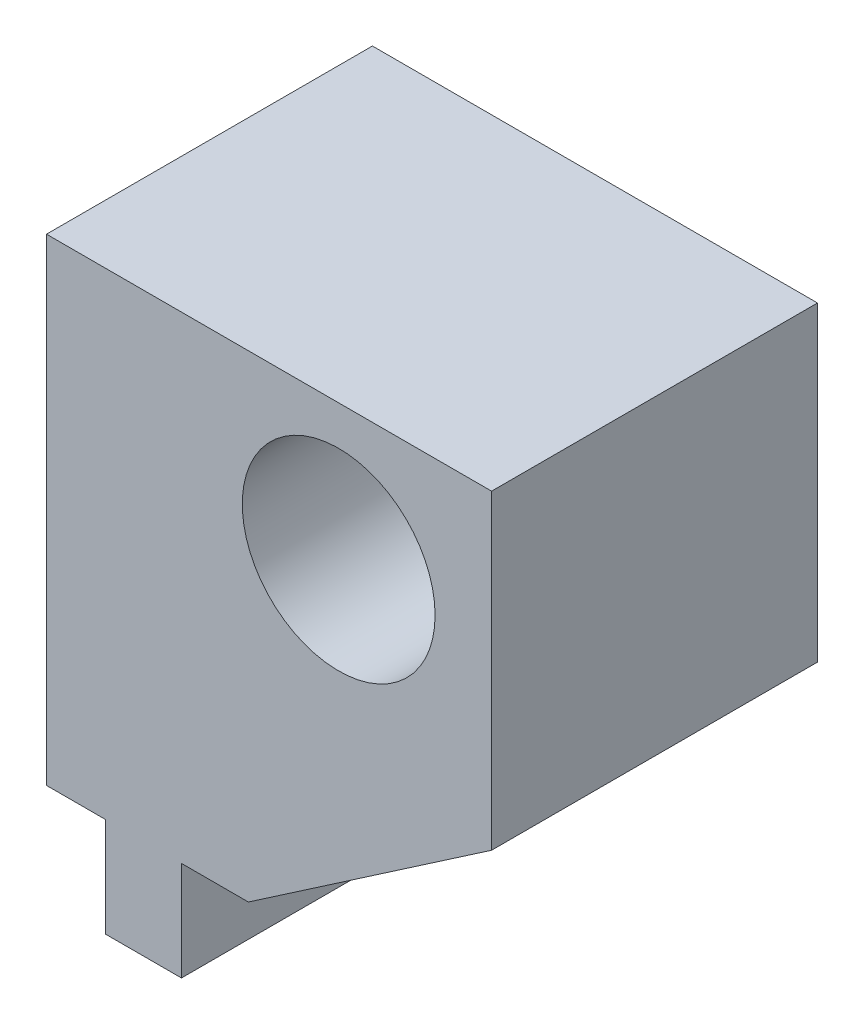
ISO-10303-21;
HEADER;
FILE_DESCRIPTION(('STEP AP214'),'2;1');
FILE_NAME('part.step','',(''),(''),'','','');
FILE_SCHEMA(('AUTOMOTIVE_DESIGN { 1 0 10303 214 1 1 1 1 }'));
ENDSEC;
DATA;
#1=APPLICATION_CONTEXT('core data for automotive mechanical design processes');
#2=APPLICATION_PROTOCOL_DEFINITION('international standard','automotive_design',2000,#1);
#3=PRODUCT_CONTEXT('',#1,'mechanical');
#4=PRODUCT('Part','Part','',(#3));
#5=PRODUCT_RELATED_PRODUCT_CATEGORY('part','',(#4));
#6=PRODUCT_DEFINITION_FORMATION('','',#4);
#7=PRODUCT_DEFINITION_CONTEXT('part definition',#1,'design');
#8=PRODUCT_DEFINITION('design','',#6,#7);
#9=PRODUCT_DEFINITION_SHAPE('','',#8);
#10=(LENGTH_UNIT() NAMED_UNIT(*) SI_UNIT(.MILLI.,.METRE.));
#11=(NAMED_UNIT(*) PLANE_ANGLE_UNIT() SI_UNIT($,.RADIAN.));
#12=(NAMED_UNIT(*) SI_UNIT($,.STERADIAN.) SOLID_ANGLE_UNIT());
#13=UNCERTAINTY_MEASURE_WITH_UNIT(LENGTH_MEASURE(1.E-05),#10,'distance_accuracy_value','');
#14=(GEOMETRIC_REPRESENTATION_CONTEXT(3) GLOBAL_UNCERTAINTY_ASSIGNED_CONTEXT((#13)) GLOBAL_UNIT_ASSIGNED_CONTEXT((#10,
#11,#12)) REPRESENTATION_CONTEXT('',''));
#15=CARTESIAN_POINT('',(0.,0.,0.));
#16=DIRECTION('',(0.,0.,1.));
#17=DIRECTION('',(1.,0.,0.));
#18=AXIS2_PLACEMENT_3D('',#15,#16,#17);
#19=CARTESIAN_POINT('',(0.,0.,36.));
#20=DIRECTION('',(0.,0.,-1.));
#21=DIRECTION('',(-1.,0.,0.));
#22=AXIS2_PLACEMENT_3D('',#19,#20,#21);
#23=PLANE('',#22);
#24=DIRECTION('',(-1.,0.,0.));
#25=VECTOR('',#24,1.);
#26=CARTESIAN_POINT('',(-32.2750876484006,15.,36.));
#27=LINE('',#26,#25);
#28=CARTESIAN_POINT('',(16.8902459314217,15.,36.));
#29=VERTEX_POINT('',#28);
#30=CARTESIAN_POINT('',(-32.2750876484006,15.,36.));
#31=VERTEX_POINT('',#30);
#32=EDGE_CURVE('E160',#29,#31,#27,.T.);
#33=ORIENTED_EDGE('',*,*,#32,.T.);
#34=DIRECTION('',(0.,-1.,0.));
#35=VECTOR('',#34,1.);
#36=CARTESIAN_POINT('',(-32.2750876484006,11.1748033875287,36.));
#37=LINE('',#36,#35);
#38=CARTESIAN_POINT('',(-32.2750876484006,-37.7378285823876,36.));
#39=VERTEX_POINT('',#38);
#40=EDGE_CURVE('E99',#31,#39,#37,.T.);
#41=ORIENTED_EDGE('',*,*,#40,.T.);
#42=DIRECTION('',(1.,0.,0.));
#43=VECTOR('',#42,1.);
#44=CARTESIAN_POINT('',(-25.7451896776057,-37.7378285823876,36.));
#45=LINE('',#44,#43);
#46=CARTESIAN_POINT('',(-25.7451896776057,-37.7378285823876,36.));
#47=VERTEX_POINT('',#46);
#48=EDGE_CURVE('E178',#39,#47,#45,.T.);
#49=ORIENTED_EDGE('',*,*,#48,.T.);
#50=DIRECTION('',(0.,-1.,0.));
#51=VECTOR('',#50,1.);
#52=CARTESIAN_POINT('',(-25.7451896776057,-48.7031289484394,36.));
#53=LINE('',#52,#51);
#54=CARTESIAN_POINT('',(-25.7451896776057,-48.7031289484394,36.));
#55=VERTEX_POINT('',#54);
#56=EDGE_CURVE('E193',#47,#55,#53,.T.);
#57=ORIENTED_EDGE('',*,*,#56,.T.);
#58=DIRECTION('',(1.,0.,0.));
#59=VECTOR('',#58,1.);
#60=CARTESIAN_POINT('',(-17.3672073754538,-48.7031289484394,36.));
#61=LINE('',#60,#59);
#62=CARTESIAN_POINT('',(-17.3672073754538,-48.7031289484394,36.));
#63=VERTEX_POINT('',#62);
#64=EDGE_CURVE('E192',#55,#63,#61,.T.);
#65=ORIENTED_EDGE('',*,*,#64,.T.);
#66=DIRECTION('',(0.,1.,0.));
#67=VECTOR('',#66,1.);
#68=CARTESIAN_POINT('',(-17.3672073754538,-37.7378285823876,36.));
#69=LINE('',#68,#67);
#70=CARTESIAN_POINT('',(-17.3672073754538,-37.7378285823876,36.));
#71=VERTEX_POINT('',#70);
#72=EDGE_CURVE('E122',#63,#71,#69,.T.);
#73=ORIENTED_EDGE('',*,*,#72,.T.);
#74=DIRECTION('',(1.,0.,0.));
#75=VECTOR('',#74,1.);
#76=CARTESIAN_POINT('',(-9.97487005002559,-37.7378285823876,36.));
#77=LINE('',#76,#75);
#78=CARTESIAN_POINT('',(-9.97487005002559,-37.7378285823876,36.));
#79=VERTEX_POINT('',#78);
#80=EDGE_CURVE('E115',#71,#79,#77,.T.);
#81=ORIENTED_EDGE('',*,*,#80,.T.);
#82=DIRECTION('',(0.825293596087087,0.564703887234402,0.));
#83=VECTOR('',#82,1.);
#84=CARTESIAN_POINT('',(16.8902459314217,-19.3554789583812,36.));
#85=LINE('',#84,#83);
#86=CARTESIAN_POINT('',(16.8902459314217,-19.3554789583812,36.));
#87=VERTEX_POINT('',#86);
#88=EDGE_CURVE('E119',#79,#87,#85,.T.);
#89=ORIENTED_EDGE('',*,*,#88,.T.);
#90=DIRECTION('',(0.,1.,0.));
#91=VECTOR('',#90,1.);
#92=CARTESIAN_POINT('',(16.8902459314217,4.29086534560921,36.));
#93=LINE('',#92,#91);
#94=EDGE_CURVE('E54',#87,#29,#93,.T.);
#95=ORIENTED_EDGE('',*,*,#94,.T.);
#96=EDGE_LOOP('',(#33,#41,#49,#57,#65,#73,#81,#89,#95));
#97=FACE_BOUND('',#96,.T.);
#98=CARTESIAN_POINT('',(0.,0.,36.));
#99=DIRECTION('',(0.,0.,1.));
#100=DIRECTION('',(1.,0.,0.));
#101=AXIS2_PLACEMENT_3D('',#98,#99,#100);
#102=CIRCLE('',#101,10.65);
#103=CARTESIAN_POINT('',(10.65,0.,36.));
#104=VERTEX_POINT('',#103);
#105=EDGE_CURVE('E145',#104,#104,#102,.T.);
#106=ORIENTED_EDGE('',*,*,#105,.F.);
#107=EDGE_LOOP('',(#106));
#108=FACE_BOUND('',#107,.T.);
#109=ADVANCED_FACE('F37',(#97,#108),#23,.F.);
#110=CARTESIAN_POINT('',(0.,0.,0.));
#111=DIRECTION('',(0.,0.,-1.));
#112=DIRECTION('',(-1.,0.,0.));
#113=AXIS2_PLACEMENT_3D('',#110,#111,#112);
#114=PLANE('',#113);
#115=DIRECTION('',(0.,-1.,0.));
#116=VECTOR('',#115,1.);
#117=CARTESIAN_POINT('',(-32.2750876484006,-37.7378285823876,0.));
#118=LINE('',#117,#116);
#119=CARTESIAN_POINT('',(-32.2750876484006,15.,0.));
#120=VERTEX_POINT('',#119);
#121=CARTESIAN_POINT('',(-32.2750876484006,-37.7378285823876,0.));
#122=VERTEX_POINT('',#121);
#123=EDGE_CURVE('E142',#120,#122,#118,.T.);
#124=ORIENTED_EDGE('',*,*,#123,.F.);
#125=DIRECTION('',(-1.,0.,0.));
#126=VECTOR('',#125,1.);
#127=CARTESIAN_POINT('',(-11.427868523813,15.,0.));
#128=LINE('',#127,#126);
#129=CARTESIAN_POINT('',(16.8902459314217,15.,0.));
#130=VERTEX_POINT('',#129);
#131=EDGE_CURVE('E157',#130,#120,#128,.T.);
#132=ORIENTED_EDGE('',*,*,#131,.F.);
#133=DIRECTION('',(0.,1.,0.));
#134=VECTOR('',#133,1.);
#135=CARTESIAN_POINT('',(16.8902459314217,15.,0.));
#136=LINE('',#135,#134);
#137=CARTESIAN_POINT('',(16.8902459314217,-19.3554789583812,0.));
#138=VERTEX_POINT('',#137);
#139=EDGE_CURVE('E86',#138,#130,#136,.T.);
#140=ORIENTED_EDGE('',*,*,#139,.F.);
#141=DIRECTION('',(0.825293596087087,0.564703887234402,0.));
#142=VECTOR('',#141,1.);
#143=CARTESIAN_POINT('',(16.8902459314217,-19.3554789583812,0.));
#144=LINE('',#143,#142);
#145=CARTESIAN_POINT('',(-9.97487005002559,-37.7378285823876,0.));
#146=VERTEX_POINT('',#145);
#147=EDGE_CURVE('E154',#146,#138,#144,.T.);
#148=ORIENTED_EDGE('',*,*,#147,.F.);
#149=DIRECTION('',(1.,0.,0.));
#150=VECTOR('',#149,1.);
#151=CARTESIAN_POINT('',(-9.97487005002559,-37.7378285823876,0.));
#152=LINE('',#151,#150);
#153=CARTESIAN_POINT('',(-17.3672073754538,-37.7378285823876,0.));
#154=VERTEX_POINT('',#153);
#155=EDGE_CURVE('E131',#154,#146,#152,.T.);
#156=ORIENTED_EDGE('',*,*,#155,.F.);
#157=DIRECTION('',(0.,1.,0.));
#158=VECTOR('',#157,1.);
#159=CARTESIAN_POINT('',(-17.3672073754538,-37.7378285823876,0.));
#160=LINE('',#159,#158);
#161=CARTESIAN_POINT('',(-17.3672073754538,-48.7031289484394,0.));
#162=VERTEX_POINT('',#161);
#163=EDGE_CURVE('E151',#162,#154,#160,.T.);
#164=ORIENTED_EDGE('',*,*,#163,.F.);
#165=DIRECTION('',(1.,0.,0.));
#166=VECTOR('',#165,1.);
#167=CARTESIAN_POINT('',(-17.3672073754538,-48.7031289484394,0.));
#168=LINE('',#167,#166);
#169=CARTESIAN_POINT('',(-25.7451896776057,-48.7031289484394,0.));
#170=VERTEX_POINT('',#169);
#171=EDGE_CURVE('E149',#170,#162,#168,.T.);
#172=ORIENTED_EDGE('',*,*,#171,.F.);
#173=DIRECTION('',(0.,-1.,0.));
#174=VECTOR('',#173,1.);
#175=CARTESIAN_POINT('',(-25.7451896776057,-48.7031289484394,0.));
#176=LINE('',#175,#174);
#177=CARTESIAN_POINT('',(-25.7451896776057,-37.7378285823876,0.));
#178=VERTEX_POINT('',#177);
#179=EDGE_CURVE('E147',#178,#170,#176,.T.);
#180=ORIENTED_EDGE('',*,*,#179,.F.);
#181=DIRECTION('',(1.,0.,0.));
#182=VECTOR('',#181,1.);
#183=CARTESIAN_POINT('',(-25.7451896776057,-37.7378285823876,0.));
#184=LINE('',#183,#182);
#185=EDGE_CURVE('E144',#122,#178,#184,.T.);
#186=ORIENTED_EDGE('',*,*,#185,.F.);
#187=EDGE_LOOP('',(#124,#132,#140,#148,#156,#164,#172,#180,#186));
#188=FACE_BOUND('',#187,.T.);
#189=CARTESIAN_POINT('',(0.,0.,0.));
#190=DIRECTION('',(0.,0.,1.));
#191=DIRECTION('',(1.,0.,0.));
#192=AXIS2_PLACEMENT_3D('',#189,#190,#191);
#193=CIRCLE('',#192,10.65);
#194=CARTESIAN_POINT('',(10.65,0.,0.));
#195=VERTEX_POINT('',#194);
#196=EDGE_CURVE('E200',#195,#195,#193,.T.);
#197=ORIENTED_EDGE('',*,*,#196,.T.);
#198=EDGE_LOOP('',(#197));
#199=FACE_BOUND('',#198,.T.);
#200=ADVANCED_FACE('F180',(#188,#199),#114,.T.);
#201=CARTESIAN_POINT('',(-32.2750876484006,-37.7378285823876,36.));
#202=DIRECTION('',(1.,0.,0.));
#203=DIRECTION('',(0.,0.,-1.));
#204=AXIS2_PLACEMENT_3D('',#201,#202,#203);
#205=PLANE('',#204);
#206=ORIENTED_EDGE('',*,*,#123,.T.);
#207=DIRECTION('',(0.,0.,-1.));
#208=VECTOR('',#207,1.);
#209=CARTESIAN_POINT('',(-32.2750876484006,-37.7378285823876,36.));
#210=LINE('',#209,#208);
#211=EDGE_CURVE('E46',#39,#122,#210,.T.);
#212=ORIENTED_EDGE('',*,*,#211,.F.);
#213=ORIENTED_EDGE('',*,*,#40,.F.);
#214=DIRECTION('',(0.,0.,-1.));
#215=VECTOR('',#214,1.);
#216=CARTESIAN_POINT('',(-32.2750876484006,15.,36.));
#217=LINE('',#216,#215);
#218=EDGE_CURVE('E11',#31,#120,#217,.T.);
#219=ORIENTED_EDGE('',*,*,#218,.T.);
#220=EDGE_LOOP('',(#206,#212,#213,#219));
#221=FACE_BOUND('',#220,.T.);
#222=ADVANCED_FACE('F39',(#221),#205,.F.);
#223=CARTESIAN_POINT('',(-25.7451896776057,-37.7378285823876,36.));
#224=DIRECTION('',(0.,1.,0.));
#225=DIRECTION('',(-1.,0.,0.));
#226=AXIS2_PLACEMENT_3D('',#223,#224,#225);
#227=PLANE('',#226);
#228=ORIENTED_EDGE('',*,*,#185,.T.);
#229=DIRECTION('',(0.,0.,-1.));
#230=VECTOR('',#229,1.);
#231=CARTESIAN_POINT('',(-25.7451896776057,-37.7378285823876,36.));
#232=LINE('',#231,#230);
#233=EDGE_CURVE('E170',#47,#178,#232,.T.);
#234=ORIENTED_EDGE('',*,*,#233,.F.);
#235=ORIENTED_EDGE('',*,*,#48,.F.);
#236=ORIENTED_EDGE('',*,*,#211,.T.);
#237=EDGE_LOOP('',(#228,#234,#235,#236));
#238=FACE_BOUND('',#237,.T.);
#239=ADVANCED_FACE('F176',(#238),#227,.F.);
#240=CARTESIAN_POINT('',(-25.7451896776057,-48.7031289484394,36.));
#241=DIRECTION('',(1.,0.,0.));
#242=DIRECTION('',(0.,0.,-1.));
#243=AXIS2_PLACEMENT_3D('',#240,#241,#242);
#244=PLANE('',#243);
#245=ORIENTED_EDGE('',*,*,#179,.T.);
#246=DIRECTION('',(0.,0.,-1.));
#247=VECTOR('',#246,1.);
#248=CARTESIAN_POINT('',(-25.7451896776057,-48.7031289484394,36.));
#249=LINE('',#248,#247);
#250=EDGE_CURVE('E167',#55,#170,#249,.T.);
#251=ORIENTED_EDGE('',*,*,#250,.F.);
#252=ORIENTED_EDGE('',*,*,#56,.F.);
#253=ORIENTED_EDGE('',*,*,#233,.T.);
#254=EDGE_LOOP('',(#245,#251,#252,#253));
#255=FACE_BOUND('',#254,.T.);
#256=ADVANCED_FACE('F186',(#255),#244,.F.);
#257=CARTESIAN_POINT('',(-17.3672073754538,-48.7031289484394,36.));
#258=DIRECTION('',(0.,1.,0.));
#259=DIRECTION('',(0.,0.,1.));
#260=AXIS2_PLACEMENT_3D('',#257,#258,#259);
#261=PLANE('',#260);
#262=ORIENTED_EDGE('',*,*,#171,.T.);
#263=DIRECTION('',(0.,0.,-1.));
#264=VECTOR('',#263,1.);
#265=CARTESIAN_POINT('',(-17.3672073754538,-48.7031289484394,36.));
#266=LINE('',#265,#264);
#267=EDGE_CURVE('E164',#63,#162,#266,.T.);
#268=ORIENTED_EDGE('',*,*,#267,.F.);
#269=ORIENTED_EDGE('',*,*,#64,.F.);
#270=ORIENTED_EDGE('',*,*,#250,.T.);
#271=EDGE_LOOP('',(#262,#268,#269,#270));
#272=FACE_BOUND('',#271,.T.);
#273=ADVANCED_FACE('F190',(#272),#261,.F.);
#274=CARTESIAN_POINT('',(-17.3672073754538,-37.7378285823876,36.));
#275=DIRECTION('',(-1.,0.,0.));
#276=DIRECTION('',(0.,0.,1.));
#277=AXIS2_PLACEMENT_3D('',#274,#275,#276);
#278=PLANE('',#277);
#279=ORIENTED_EDGE('',*,*,#163,.T.);
#280=DIRECTION('',(0.,0.,-1.));
#281=VECTOR('',#280,1.);
#282=CARTESIAN_POINT('',(-17.3672073754538,-37.7378285823876,36.));
#283=LINE('',#282,#281);
#284=EDGE_CURVE('E133',#71,#154,#283,.T.);
#285=ORIENTED_EDGE('',*,*,#284,.F.);
#286=ORIENTED_EDGE('',*,*,#72,.F.);
#287=ORIENTED_EDGE('',*,*,#267,.T.);
#288=EDGE_LOOP('',(#279,#285,#286,#287));
#289=FACE_BOUND('',#288,.T.);
#290=ADVANCED_FACE('F227',(#289),#278,.F.);
#291=CARTESIAN_POINT('',(-9.97487005002559,-37.7378285823876,36.));
#292=DIRECTION('',(0.,1.,0.));
#293=DIRECTION('',(0.,0.,1.));
#294=AXIS2_PLACEMENT_3D('',#291,#292,#293);
#295=PLANE('',#294);
#296=ORIENTED_EDGE('',*,*,#155,.T.);
#297=DIRECTION('',(0.,0.,-1.));
#298=VECTOR('',#297,1.);
#299=CARTESIAN_POINT('',(-9.97487005002559,-37.7378285823876,36.));
#300=LINE('',#299,#298);
#301=EDGE_CURVE('E128',#79,#146,#300,.T.);
#302=ORIENTED_EDGE('',*,*,#301,.F.);
#303=ORIENTED_EDGE('',*,*,#80,.F.);
#304=ORIENTED_EDGE('',*,*,#284,.T.);
#305=EDGE_LOOP('',(#296,#302,#303,#304));
#306=FACE_BOUND('',#305,.T.);
#307=ADVANCED_FACE('F129',(#306),#295,.F.);
#308=CARTESIAN_POINT('',(16.8902459314217,-19.3554789583812,36.));
#309=DIRECTION('',(-0.564703887234402,0.825293596087087,0.));
#310=DIRECTION('',(-0.825293596087087,-0.564703887234402,0.));
#311=AXIS2_PLACEMENT_3D('',#308,#309,#310);
#312=PLANE('',#311);
#313=ORIENTED_EDGE('',*,*,#147,.T.);
#314=DIRECTION('',(0.,0.,-1.));
#315=VECTOR('',#314,1.);
#316=CARTESIAN_POINT('',(16.8902459314217,-19.3554789583812,36.));
#317=LINE('',#316,#315);
#318=EDGE_CURVE('E134',#87,#138,#317,.T.);
#319=ORIENTED_EDGE('',*,*,#318,.F.);
#320=ORIENTED_EDGE('',*,*,#88,.F.);
#321=ORIENTED_EDGE('',*,*,#301,.T.);
#322=EDGE_LOOP('',(#313,#319,#320,#321));
#323=FACE_BOUND('',#322,.T.);
#324=ADVANCED_FACE('F136',(#323),#312,.F.);
#325=CARTESIAN_POINT('',(16.8902459314217,15.,36.));
#326=DIRECTION('',(-1.,0.,0.));
#327=DIRECTION('',(0.,-1.,0.));
#328=AXIS2_PLACEMENT_3D('',#325,#326,#327);
#329=PLANE('',#328);
#330=ORIENTED_EDGE('',*,*,#139,.T.);
#331=DIRECTION('',(0.,0.,-1.));
#332=VECTOR('',#331,1.);
#333=CARTESIAN_POINT('',(16.8902459314217,15.,36.));
#334=LINE('',#333,#332);
#335=EDGE_CURVE('E138',#29,#130,#334,.T.);
#336=ORIENTED_EDGE('',*,*,#335,.F.);
#337=ORIENTED_EDGE('',*,*,#94,.F.);
#338=ORIENTED_EDGE('',*,*,#318,.T.);
#339=EDGE_LOOP('',(#330,#336,#337,#338));
#340=FACE_BOUND('',#339,.T.);
#341=ADVANCED_FACE('F219',(#340),#329,.F.);
#342=CARTESIAN_POINT('',(-11.427868523813,15.,36.));
#343=DIRECTION('',(0.,-1.,0.));
#344=DIRECTION('',(0.,0.,-1.));
#345=AXIS2_PLACEMENT_3D('',#342,#343,#344);
#346=PLANE('',#345);
#347=ORIENTED_EDGE('',*,*,#131,.T.);
#348=ORIENTED_EDGE('',*,*,#218,.F.);
#349=ORIENTED_EDGE('',*,*,#32,.F.);
#350=ORIENTED_EDGE('',*,*,#335,.T.);
#351=EDGE_LOOP('',(#347,#348,#349,#350));
#352=FACE_BOUND('',#351,.T.);
#353=ADVANCED_FACE('F216',(#352),#346,.F.);
#354=CARTESIAN_POINT('',(0.,0.,36.));
#355=DIRECTION('',(0.,0.,-1.));
#356=DIRECTION('',(-1.,0.,0.));
#357=AXIS2_PLACEMENT_3D('',#354,#355,#356);
#358=CYLINDRICAL_SURFACE('',#357,10.65);
#359=ORIENTED_EDGE('',*,*,#105,.T.);
#360=EDGE_LOOP('',(#359));
#361=FACE_BOUND('',#360,.T.);
#362=ORIENTED_EDGE('',*,*,#196,.F.);
#363=EDGE_LOOP('',(#362));
#364=FACE_BOUND('',#363,.T.);
#365=ADVANCED_FACE('F206',(#361,#364),#358,.F.);
#366=CLOSED_SHELL('',(#109,#200,#222,#239,#256,#273,#290,#307,#324,#341,#353,#365));
#367=MANIFOLD_SOLID_BREP('B2',#366);
#368=ADVANCED_BREP_SHAPE_REPRESENTATION('',(#18,#367),#14);
#369=SHAPE_DEFINITION_REPRESENTATION(#9,#368);
ENDSEC;
END-ISO-10303-21;
